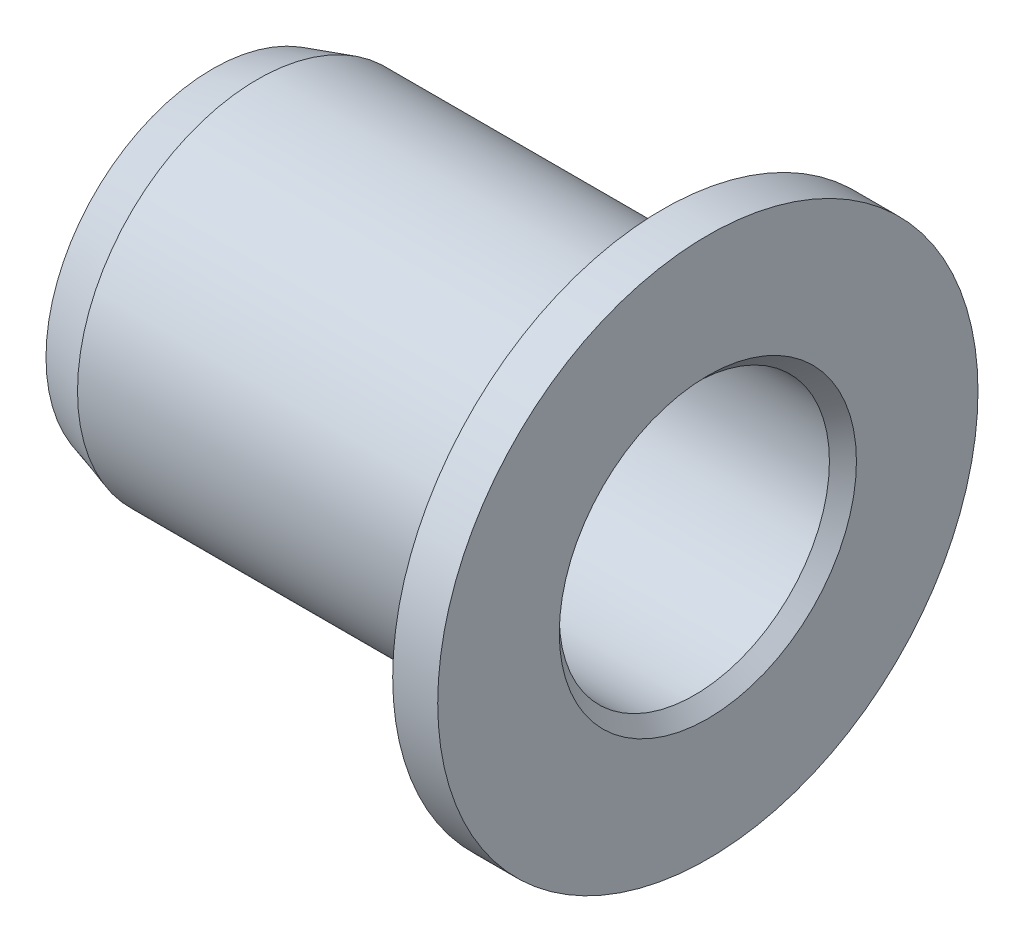
ISO-10303-21;
HEADER;
FILE_DESCRIPTION(('STEP AP214'),'2;1');
FILE_NAME('part.step','',(''),(''),'','','');
FILE_SCHEMA(('AUTOMOTIVE_DESIGN { 1 0 10303 214 1 1 1 1 }'));
ENDSEC;
DATA;
#1=APPLICATION_CONTEXT('core data for automotive mechanical design processes');
#2=APPLICATION_PROTOCOL_DEFINITION('international standard','automotive_design',2000,#1);
#3=PRODUCT_CONTEXT('',#1,'mechanical');
#4=PRODUCT('Part','Part','',(#3));
#5=PRODUCT_RELATED_PRODUCT_CATEGORY('part','',(#4));
#6=PRODUCT_DEFINITION_FORMATION('','',#4);
#7=PRODUCT_DEFINITION_CONTEXT('part definition',#1,'design');
#8=PRODUCT_DEFINITION('design','',#6,#7);
#9=PRODUCT_DEFINITION_SHAPE('','',#8);
#10=(LENGTH_UNIT() NAMED_UNIT(*) SI_UNIT(.MILLI.,.METRE.));
#11=(NAMED_UNIT(*) PLANE_ANGLE_UNIT() SI_UNIT($,.RADIAN.));
#12=(NAMED_UNIT(*) SI_UNIT($,.STERADIAN.) SOLID_ANGLE_UNIT());
#13=UNCERTAINTY_MEASURE_WITH_UNIT(LENGTH_MEASURE(1.E-05),#10,'distance_accuracy_value','');
#14=(GEOMETRIC_REPRESENTATION_CONTEXT(3) GLOBAL_UNCERTAINTY_ASSIGNED_CONTEXT((#13)) GLOBAL_UNIT_ASSIGNED_CONTEXT((#10,
#11,#12)) REPRESENTATION_CONTEXT('',''));
#15=CARTESIAN_POINT('',(0.,0.,0.));
#16=DIRECTION('',(0.,0.,1.));
#17=DIRECTION('',(1.,0.,0.));
#18=AXIS2_PLACEMENT_3D('',#15,#16,#17);
#19=CARTESIAN_POINT('',(0.,0.,0.));
#20=DIRECTION('',(-1.,0.,0.));
#21=DIRECTION('',(0.,0.,1.));
#22=AXIS2_PLACEMENT_3D('',#19,#20,#21);
#23=CYLINDRICAL_SURFACE('',#22,3.);
#24=CARTESIAN_POINT('',(-0.300000000000003,0.,0.));
#25=DIRECTION('',(-1.,0.,0.));
#26=DIRECTION('',(0.,0.,1.));
#27=AXIS2_PLACEMENT_3D('',#24,#25,#26);
#28=CIRCLE('',#27,3.);
#29=CARTESIAN_POINT('',(-0.300000000000003,0.,-3.));
#30=VERTEX_POINT('',#29);
#31=EDGE_CURVE('E43',#30,#30,#28,.F.);
#32=ORIENTED_EDGE('',*,*,#31,.T.);
#33=EDGE_LOOP('',(#32));
#34=FACE_BOUND('',#33,.T.);
#35=CARTESIAN_POINT('',(-11.,0.,0.));
#36=DIRECTION('',(-1.,0.,0.));
#37=DIRECTION('',(0.,0.,1.));
#38=AXIS2_PLACEMENT_3D('',#35,#36,#37);
#39=CIRCLE('',#38,3.);
#40=CARTESIAN_POINT('',(-11.,0.,3.));
#41=VERTEX_POINT('',#40);
#42=EDGE_CURVE('E61',#41,#41,#39,.T.);
#43=ORIENTED_EDGE('',*,*,#42,.T.);
#44=EDGE_LOOP('',(#43));
#45=FACE_BOUND('',#44,.T.);
#46=ADVANCED_FACE('F32',(#34,#45),#23,.F.);
#47=CARTESIAN_POINT('',(0.,3.,0.));
#48=DIRECTION('',(-1.,0.,0.));
#49=DIRECTION('',(0.,0.,1.));
#50=AXIS2_PLACEMENT_3D('',#47,#48,#49);
#51=PLANE('',#50);
#52=CARTESIAN_POINT('',(0.,0.,0.));
#53=DIRECTION('',(-1.,0.,0.));
#54=DIRECTION('',(0.,0.,1.));
#55=AXIS2_PLACEMENT_3D('',#52,#53,#54);
#56=CIRCLE('',#55,3.3);
#57=CARTESIAN_POINT('',(0.,0.,-3.3));
#58=VERTEX_POINT('',#57);
#59=EDGE_CURVE('E47',#58,#58,#56,.T.);
#60=ORIENTED_EDGE('',*,*,#59,.T.);
#61=EDGE_LOOP('',(#60));
#62=FACE_BOUND('',#61,.T.);
#63=CARTESIAN_POINT('',(0.,0.,0.));
#64=DIRECTION('',(-1.,0.,0.));
#65=DIRECTION('',(0.,0.,1.));
#66=AXIS2_PLACEMENT_3D('',#63,#64,#65);
#67=CIRCLE('',#66,6.);
#68=CARTESIAN_POINT('',(0.,0.,6.));
#69=VERTEX_POINT('',#68);
#70=EDGE_CURVE('E52',#69,#69,#67,.T.);
#71=ORIENTED_EDGE('',*,*,#70,.F.);
#72=EDGE_LOOP('',(#71));
#73=FACE_BOUND('',#72,.T.);
#74=ADVANCED_FACE('F79',(#62,#73),#51,.F.);
#75=CARTESIAN_POINT('',(0.,0.,0.));
#76=DIRECTION('',(-1.,0.,0.));
#77=DIRECTION('',(0.,0.,1.));
#78=AXIS2_PLACEMENT_3D('',#75,#76,#77);
#79=CYLINDRICAL_SURFACE('',#78,6.);
#80=CARTESIAN_POINT('',(-1.,0.,0.));
#81=DIRECTION('',(-1.,0.,0.));
#82=DIRECTION('',(0.,0.,1.));
#83=AXIS2_PLACEMENT_3D('',#80,#81,#82);
#84=CIRCLE('',#83,6.);
#85=CARTESIAN_POINT('',(-1.,0.,6.));
#86=VERTEX_POINT('',#85);
#87=EDGE_CURVE('E55',#86,#86,#84,.T.);
#88=ORIENTED_EDGE('',*,*,#87,.F.);
#89=EDGE_LOOP('',(#88));
#90=FACE_BOUND('',#89,.T.);
#91=ORIENTED_EDGE('',*,*,#70,.T.);
#92=EDGE_LOOP('',(#91));
#93=FACE_BOUND('',#92,.T.);
#94=ADVANCED_FACE('F85',(#90,#93),#79,.T.);
#95=CARTESIAN_POINT('',(-1.,6.,0.));
#96=DIRECTION('',(1.,0.,0.));
#97=DIRECTION('',(0.,0.,-1.));
#98=AXIS2_PLACEMENT_3D('',#95,#96,#97);
#99=PLANE('',#98);
#100=CARTESIAN_POINT('',(-1.,0.,0.));
#101=DIRECTION('',(-1.,0.,0.));
#102=DIRECTION('',(0.,0.,1.));
#103=AXIS2_PLACEMENT_3D('',#100,#101,#102);
#104=CIRCLE('',#103,4.);
#105=CARTESIAN_POINT('',(-1.,0.,4.));
#106=VERTEX_POINT('',#105);
#107=EDGE_CURVE('E58',#106,#106,#104,.T.);
#108=ORIENTED_EDGE('',*,*,#107,.F.);
#109=EDGE_LOOP('',(#108));
#110=FACE_BOUND('',#109,.T.);
#111=ORIENTED_EDGE('',*,*,#87,.T.);
#112=EDGE_LOOP('',(#111));
#113=FACE_BOUND('',#112,.T.);
#114=ADVANCED_FACE('F76',(#110,#113),#99,.F.);
#115=CARTESIAN_POINT('',(0.,0.,0.));
#116=DIRECTION('',(-1.,0.,0.));
#117=DIRECTION('',(0.,0.,1.));
#118=AXIS2_PLACEMENT_3D('',#115,#116,#117);
#119=CYLINDRICAL_SURFACE('',#118,4.);
#120=CARTESIAN_POINT('',(-9.99999999999999,0.,0.));
#121=DIRECTION('',(1.,0.,0.));
#122=DIRECTION('',(0.,0.,-1.));
#123=AXIS2_PLACEMENT_3D('',#120,#121,#122);
#124=CIRCLE('',#123,4.);
#125=CARTESIAN_POINT('',(-9.99999999999999,0.,-4.));
#126=VERTEX_POINT('',#125);
#127=EDGE_CURVE('E10',#126,#126,#124,.T.);
#128=ORIENTED_EDGE('',*,*,#127,.T.);
#129=EDGE_LOOP('',(#128));
#130=FACE_BOUND('',#129,.T.);
#131=ORIENTED_EDGE('',*,*,#107,.T.);
#132=EDGE_LOOP('',(#131));
#133=FACE_BOUND('',#132,.T.);
#134=ADVANCED_FACE('F69',(#130,#133),#119,.T.);
#135=CARTESIAN_POINT('',(-11.,4.,0.));
#136=DIRECTION('',(1.,0.,0.));
#137=DIRECTION('',(0.,0.,-1.));
#138=AXIS2_PLACEMENT_3D('',#135,#136,#137);
#139=PLANE('',#138);
#140=CARTESIAN_POINT('',(-11.,0.,0.));
#141=DIRECTION('',(1.,0.,0.));
#142=DIRECTION('',(0.,0.,-1.));
#143=AXIS2_PLACEMENT_3D('',#140,#141,#142);
#144=CIRCLE('',#143,3.7);
#145=CARTESIAN_POINT('',(-11.,0.,-3.7));
#146=VERTEX_POINT('',#145);
#147=EDGE_CURVE('E39',#146,#146,#144,.F.);
#148=ORIENTED_EDGE('',*,*,#147,.T.);
#149=EDGE_LOOP('',(#148));
#150=FACE_BOUND('',#149,.T.);
#151=ORIENTED_EDGE('',*,*,#42,.F.);
#152=EDGE_LOOP('',(#151));
#153=FACE_BOUND('',#152,.T.);
#154=ADVANCED_FACE('F66',(#150,#153),#139,.F.);
#155=CARTESIAN_POINT('',(0.,0.,0.));
#156=DIRECTION('',(1.,0.,0.));
#157=DIRECTION('',(0.,0.,-1.));
#158=AXIS2_PLACEMENT_3D('',#155,#156,#157);
#159=CONICAL_SURFACE('',#158,3.3,0.785398163397445);
#160=CARTESIAN_POINT('',(-0.300000000000003,0.,-3.));
#161=CARTESIAN_POINT('',(-0.296875000000003,0.,-3.003125));
#162=CARTESIAN_POINT('',(-0.293750000000003,0.,-3.00625));
#163=CARTESIAN_POINT('',(-0.287500000000003,0.,-3.0125));
#164=CARTESIAN_POINT('',(-0.284375000000003,0.,-3.015625));
#165=CARTESIAN_POINT('',(-0.278125000000003,0.,-3.021875));
#166=CARTESIAN_POINT('',(-0.275000000000003,0.,-3.025));
#167=CARTESIAN_POINT('',(-0.268750000000003,0.,-3.03125));
#168=CARTESIAN_POINT('',(-0.265625000000003,0.,-3.034375));
#169=CARTESIAN_POINT('',(-0.259375000000003,0.,-3.040625));
#170=CARTESIAN_POINT('',(-0.256250000000003,0.,-3.04375));
#171=CARTESIAN_POINT('',(-0.250000000000002,0.,-3.05));
#172=CARTESIAN_POINT('',(-0.246875000000003,0.,-3.053125));
#173=CARTESIAN_POINT('',(-0.240625000000002,0.,-3.059375));
#174=CARTESIAN_POINT('',(-0.237500000000002,0.,-3.0625));
#175=CARTESIAN_POINT('',(-0.231250000000002,0.,-3.06875));
#176=CARTESIAN_POINT('',(-0.228125000000002,0.,-3.071875));
#177=CARTESIAN_POINT('',(-0.221875000000002,0.,-3.078125));
#178=CARTESIAN_POINT('',(-0.218750000000002,0.,-3.08125));
#179=CARTESIAN_POINT('',(-0.212500000000002,0.,-3.0875));
#180=CARTESIAN_POINT('',(-0.209375000000002,0.,-3.090625));
#181=CARTESIAN_POINT('',(-0.203125000000002,0.,-3.096875));
#182=CARTESIAN_POINT('',(-0.200000000000002,0.,-3.1));
#183=CARTESIAN_POINT('',(-0.193750000000002,0.,-3.10625));
#184=CARTESIAN_POINT('',(-0.190625000000002,0.,-3.109375));
#185=CARTESIAN_POINT('',(-0.184375000000002,0.,-3.115625));
#186=CARTESIAN_POINT('',(-0.181250000000002,0.,-3.11875));
#187=CARTESIAN_POINT('',(-0.175000000000002,0.,-3.125));
#188=CARTESIAN_POINT('',(-0.171875000000002,0.,-3.128125));
#189=CARTESIAN_POINT('',(-0.165625000000002,0.,-3.134375));
#190=CARTESIAN_POINT('',(-0.162500000000002,0.,-3.1375));
#191=CARTESIAN_POINT('',(-0.156250000000002,0.,-3.14375));
#192=CARTESIAN_POINT('',(-0.153125000000002,0.,-3.146875));
#193=CARTESIAN_POINT('',(-0.146875000000001,0.,-3.153125));
#194=CARTESIAN_POINT('',(-0.143750000000001,0.,-3.15625));
#195=CARTESIAN_POINT('',(-0.137500000000001,0.,-3.1625));
#196=CARTESIAN_POINT('',(-0.134375000000001,0.,-3.165625));
#197=CARTESIAN_POINT('',(-0.128125000000001,0.,-3.171875));
#198=CARTESIAN_POINT('',(-0.125000000000001,0.,-3.175));
#199=CARTESIAN_POINT('',(-0.118750000000001,0.,-3.18125));
#200=CARTESIAN_POINT('',(-0.115625000000001,0.,-3.184375));
#201=CARTESIAN_POINT('',(-0.109375000000001,0.,-3.190625));
#202=CARTESIAN_POINT('',(-0.106250000000001,0.,-3.19375));
#203=CARTESIAN_POINT('',(-0.100000000000001,0.,-3.2));
#204=CARTESIAN_POINT('',(-0.0968750000000009,0.,-3.203125));
#205=CARTESIAN_POINT('',(-0.0906250000000009,0.,-3.209375));
#206=CARTESIAN_POINT('',(-0.0875000000000009,0.,-3.2125));
#207=CARTESIAN_POINT('',(-0.0812500000000009,0.,-3.21875));
#208=CARTESIAN_POINT('',(-0.0781250000000007,0.,-3.221875));
#209=CARTESIAN_POINT('',(-0.0718750000000007,0.,-3.228125));
#210=CARTESIAN_POINT('',(-0.0687500000000007,0.,-3.23125));
#211=CARTESIAN_POINT('',(-0.0625000000000007,0.,-3.2375));
#212=CARTESIAN_POINT('',(-0.0593750000000006,0.,-3.240625));
#213=CARTESIAN_POINT('',(-0.0531250000000005,0.,-3.246875));
#214=CARTESIAN_POINT('',(-0.0500000000000005,0.,-3.25));
#215=CARTESIAN_POINT('',(-0.0437500000000005,0.,-3.25625));
#216=CARTESIAN_POINT('',(-0.0406250000000004,0.,-3.259375));
#217=CARTESIAN_POINT('',(-0.0343750000000003,0.,-3.265625));
#218=CARTESIAN_POINT('',(-0.0312500000000003,0.,-3.26875));
#219=CARTESIAN_POINT('',(-0.0250000000000003,0.,-3.275));
#220=CARTESIAN_POINT('',(-0.0218750000000002,0.,-3.278125));
#221=CARTESIAN_POINT('',(-0.0156250000000002,0.,-3.284375));
#222=CARTESIAN_POINT('',(-0.0125000000000001,0.,-3.2875));
#223=CARTESIAN_POINT('',(-0.00625000000000002,0.,-3.29375));
#224=CARTESIAN_POINT('',(-0.00312499999999998,0.,-3.296875));
#225=CARTESIAN_POINT('',(0.,0.,-3.3));
#226=B_SPLINE_CURVE_WITH_KNOTS('',3,(#160,#161,#162,#163,#164,#165,#166,#167,#168,#169,#170,
#171,#172,#173,#174,#175,#176,#177,#178,#179,#180,#181,#182,#183,#184,#185,#186,#187,#188,#189,
#190,#191,#192,#193,#194,#195,#196,#197,#198,#199,#200,#201,#202,#203,#204,#205,#206,#207,#208,
#209,#210,#211,#212,#213,#214,#215,#216,#217,#218,#219,#220,#221,#222,#223,#224,#225),
.UNSPECIFIED.,.F.,.F.,(4,2,2,2,2,2,2,2,2,2,2,2,2,2,2,2,2,2,2,2,2,2,2,2,2,2,2,2,2,2,2,2,4),(0.,
0.0132582521472477,0.0265165042944958,0.0397747564417434,0.0530330085889915,0.0662912607362392,
0.0795495128834872,0.092807765030735,0.106066017177983,0.119324269325231,0.132582521472478,
0.145840773619726,0.159099025766974,0.172357277914222,0.18561553006147,0.198873782208718,
0.212132034355966,0.225390286503214,0.238648538650461,0.251906790797709,0.265165042944957,
0.278423295092205,0.291681547239453,0.304939799386701,0.318198051533949,0.331456303681197,
0.344714555828444,0.357972807975692,0.37123106012294,0.384489312270188,0.397747564417436,
0.411005816564684,0.424264068711932),.UNSPECIFIED.);
#227=EDGE_CURVE('BSEAM68',#30,#58,#226,.T.);
#228=ORIENTED_EDGE('',*,*,#31,.F.);
#229=ORIENTED_EDGE('',*,*,#59,.F.);
#230=ORIENTED_EDGE('',*,*,#227,.T.);
#231=ORIENTED_EDGE('',*,*,#227,.F.);
#232=EDGE_LOOP('',(#228,#230,#229,#231));
#233=FACE_BOUND('',#232,.T.);
#234=ADVANCED_FACE('F68',(#233),#159,.F.);
#235=CARTESIAN_POINT('',(-11.,0.,0.));
#236=DIRECTION('',(1.,0.,0.));
#237=DIRECTION('',(0.,0.,-1.));
#238=AXIS2_PLACEMENT_3D('',#235,#236,#237);
#239=CONICAL_SURFACE('',#238,3.7,0.291456794477864);
#240=ORIENTED_EDGE('',*,*,#127,.F.);
#241=EDGE_LOOP('',(#240));
#242=FACE_BOUND('',#241,.T.);
#243=ORIENTED_EDGE('',*,*,#147,.F.);
#244=EDGE_LOOP('',(#243));
#245=FACE_BOUND('',#244,.T.);
#246=ADVANCED_FACE('F34',(#242,#245),#239,.T.);
#247=CLOSED_SHELL('',(#46,#74,#94,#114,#134,#154,#234,#246));
#248=MANIFOLD_SOLID_BREP('B2',#247);
#249=ADVANCED_BREP_SHAPE_REPRESENTATION('',(#18,#248),#14);
#250=SHAPE_DEFINITION_REPRESENTATION(#9,#249);
ENDSEC;
END-ISO-10303-21;
